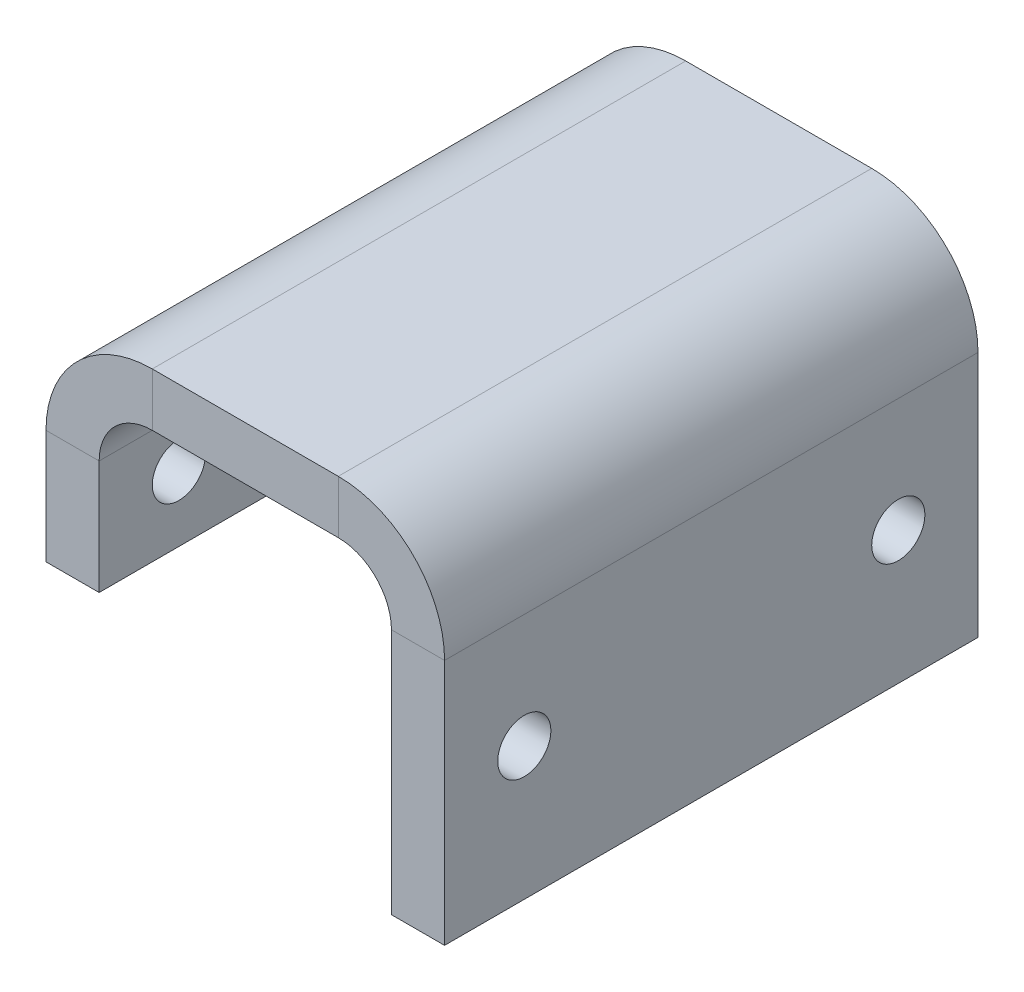
ISO-10303-21;
HEADER;
FILE_DESCRIPTION(('STEP AP214'),'2;1');
FILE_NAME('part.step','',(''),(''),'','','');
FILE_SCHEMA(('AUTOMOTIVE_DESIGN { 1 0 10303 214 1 1 1 1 }'));
ENDSEC;
DATA;
#1=APPLICATION_CONTEXT('core data for automotive mechanical design processes');
#2=APPLICATION_PROTOCOL_DEFINITION('international standard','automotive_design',2000,#1);
#3=PRODUCT_CONTEXT('',#1,'mechanical');
#4=PRODUCT('Part','Part','',(#3));
#5=PRODUCT_RELATED_PRODUCT_CATEGORY('part','',(#4));
#6=PRODUCT_DEFINITION_FORMATION('','',#4);
#7=PRODUCT_DEFINITION_CONTEXT('part definition',#1,'design');
#8=PRODUCT_DEFINITION('design','',#6,#7);
#9=PRODUCT_DEFINITION_SHAPE('','',#8);
#10=(LENGTH_UNIT() NAMED_UNIT(*) SI_UNIT(.MILLI.,.METRE.));
#11=(NAMED_UNIT(*) PLANE_ANGLE_UNIT() SI_UNIT($,.RADIAN.));
#12=(NAMED_UNIT(*) SI_UNIT($,.STERADIAN.) SOLID_ANGLE_UNIT());
#13=UNCERTAINTY_MEASURE_WITH_UNIT(LENGTH_MEASURE(1.E-05),#10,'distance_accuracy_value','');
#14=(GEOMETRIC_REPRESENTATION_CONTEXT(3) GLOBAL_UNCERTAINTY_ASSIGNED_CONTEXT((#13)) GLOBAL_UNIT_ASSIGNED_CONTEXT((#10,
#11,#12)) REPRESENTATION_CONTEXT('',''));
#15=CARTESIAN_POINT('',(0.,0.,0.));
#16=DIRECTION('',(0.,0.,1.));
#17=DIRECTION('',(1.,0.,0.));
#18=AXIS2_PLACEMENT_3D('',#15,#16,#17);
#19=CARTESIAN_POINT('',(-30.,-4.,20.075));
#20=DIRECTION('',(0.,0.,1.));
#21=DIRECTION('',(1.,0.,0.));
#22=AXIS2_PLACEMENT_3D('',#19,#20,#21);
#23=PLANE('',#22);
#24=DIRECTION('',(1.,0.,0.));
#25=VECTOR('',#24,1.);
#26=CARTESIAN_POINT('',(-30.,-4.,20.075));
#27=LINE('',#26,#25);
#28=CARTESIAN_POINT('',(-12.,-4.,20.075));
#29=VERTEX_POINT('',#28);
#30=CARTESIAN_POINT('',(2.00000000000003,-4.,20.075));
#31=VERTEX_POINT('',#30);
#32=EDGE_CURVE('E219',#29,#31,#27,.T.);
#33=ORIENTED_EDGE('',*,*,#32,.T.);
#34=DIRECTION('',(0.,1.,0.));
#35=VECTOR('',#34,1.);
#36=CARTESIAN_POINT('',(2.00000000000003,-4.,20.075));
#37=LINE('',#36,#35);
#38=CARTESIAN_POINT('',(2.00000000000003,0.,20.075));
#39=VERTEX_POINT('',#38);
#40=EDGE_CURVE('E12',#31,#39,#37,.T.);
#41=ORIENTED_EDGE('',*,*,#40,.T.);
#42=DIRECTION('',(1.,0.,0.));
#43=VECTOR('',#42,1.);
#44=CARTESIAN_POINT('',(-30.,0.,20.075));
#45=LINE('',#44,#43);
#46=CARTESIAN_POINT('',(-12.,0.,20.075));
#47=VERTEX_POINT('',#46);
#48=EDGE_CURVE('E203',#47,#39,#45,.T.);
#49=ORIENTED_EDGE('',*,*,#48,.F.);
#50=DIRECTION('',(0.,1.,0.));
#51=VECTOR('',#50,1.);
#52=CARTESIAN_POINT('',(-12.,-4.,20.075));
#53=LINE('',#52,#51);
#54=EDGE_CURVE('E208',#29,#47,#53,.T.);
#55=ORIENTED_EDGE('',*,*,#54,.F.);
#56=EDGE_LOOP('',(#33,#41,#49,#55));
#57=FACE_BOUND('',#56,.T.);
#58=ADVANCED_FACE('F45',(#57),#23,.T.);
#59=CARTESIAN_POINT('',(-30.,-4.,-20.075));
#60=DIRECTION('',(0.,0.,-1.));
#61=DIRECTION('',(-1.,0.,0.));
#62=AXIS2_PLACEMENT_3D('',#59,#60,#61);
#63=PLANE('',#62);
#64=DIRECTION('',(-1.,0.,0.));
#65=VECTOR('',#64,1.);
#66=CARTESIAN_POINT('',(-30.,0.,-20.075));
#67=LINE('',#66,#65);
#68=CARTESIAN_POINT('',(2.00000000000002,0.,-20.075));
#69=VERTEX_POINT('',#68);
#70=CARTESIAN_POINT('',(-12.,0.,-20.075));
#71=VERTEX_POINT('',#70);
#72=EDGE_CURVE('E204',#69,#71,#67,.T.);
#73=ORIENTED_EDGE('',*,*,#72,.F.);
#74=DIRECTION('',(0.,-1.,0.));
#75=VECTOR('',#74,1.);
#76=CARTESIAN_POINT('',(2.00000000000002,-4.,-20.075));
#77=LINE('',#76,#75);
#78=CARTESIAN_POINT('',(2.00000000000002,-4.,-20.075));
#79=VERTEX_POINT('',#78);
#80=EDGE_CURVE('E260',#69,#79,#77,.T.);
#81=ORIENTED_EDGE('',*,*,#80,.T.);
#82=DIRECTION('',(-1.,0.,0.));
#83=VECTOR('',#82,1.);
#84=CARTESIAN_POINT('',(-30.,-4.,-20.075));
#85=LINE('',#84,#83);
#86=CARTESIAN_POINT('',(-12.,-4.,-20.075));
#87=VERTEX_POINT('',#86);
#88=EDGE_CURVE('E48',#79,#87,#85,.T.);
#89=ORIENTED_EDGE('',*,*,#88,.T.);
#90=DIRECTION('',(0.,-1.,0.));
#91=VECTOR('',#90,1.);
#92=CARTESIAN_POINT('',(-12.,-4.,-20.075));
#93=LINE('',#92,#91);
#94=EDGE_CURVE('E205',#71,#87,#93,.T.);
#95=ORIENTED_EDGE('',*,*,#94,.F.);
#96=EDGE_LOOP('',(#73,#81,#89,#95));
#97=FACE_BOUND('',#96,.T.);
#98=ADVANCED_FACE('F273',(#97),#63,.T.);
#99=CARTESIAN_POINT('',(0.,-4.,0.));
#100=DIRECTION('',(0.,-1.,0.));
#101=DIRECTION('',(0.,0.,-1.));
#102=AXIS2_PLACEMENT_3D('',#99,#100,#101);
#103=PLANE('',#102);
#104=ORIENTED_EDGE('',*,*,#88,.F.);
#105=DIRECTION('',(0.,0.,1.));
#106=VECTOR('',#105,1.);
#107=CARTESIAN_POINT('',(2.00000000000003,-4.,0.));
#108=LINE('',#107,#106);
#109=EDGE_CURVE('E251',#79,#31,#108,.T.);
#110=ORIENTED_EDGE('',*,*,#109,.T.);
#111=ORIENTED_EDGE('',*,*,#32,.F.);
#112=DIRECTION('',(0.,0.,1.));
#113=VECTOR('',#112,1.);
#114=CARTESIAN_POINT('',(-12.,-4.,0.));
#115=LINE('',#114,#113);
#116=EDGE_CURVE('E195',#87,#29,#115,.T.);
#117=ORIENTED_EDGE('',*,*,#116,.F.);
#118=EDGE_LOOP('',(#104,#110,#111,#117));
#119=FACE_BOUND('',#118,.T.);
#120=ADVANCED_FACE('F276',(#119),#103,.T.);
#121=CARTESIAN_POINT('',(-16.,-16.5752220392306,20.075));
#122=DIRECTION('',(0.,0.,1.));
#123=DIRECTION('',(0.,1.,0.));
#124=AXIS2_PLACEMENT_3D('',#121,#122,#123);
#125=PLANE('',#124);
#126=DIRECTION('',(0.,1.,0.));
#127=VECTOR('',#126,1.);
#128=CARTESIAN_POINT('',(-16.,-16.5752220392306,20.075));
#129=LINE('',#128,#127);
#130=CARTESIAN_POINT('',(-16.,-16.5752220392306,20.075));
#131=VERTEX_POINT('',#130);
#132=CARTESIAN_POINT('',(-16.,-8.00000000000001,20.075));
#133=VERTEX_POINT('',#132);
#134=EDGE_CURVE('E229',#131,#133,#129,.T.);
#135=ORIENTED_EDGE('',*,*,#134,.T.);
#136=DIRECTION('',(-1.,0.,0.));
#137=VECTOR('',#136,1.);
#138=CARTESIAN_POINT('',(-16.,-8.00000000000001,20.075));
#139=LINE('',#138,#137);
#140=CARTESIAN_POINT('',(-20.,-8.00000000000004,20.075));
#141=VERTEX_POINT('',#140);
#142=EDGE_CURVE('E248',#133,#141,#139,.T.);
#143=ORIENTED_EDGE('',*,*,#142,.T.);
#144=DIRECTION('',(0.,1.,0.));
#145=VECTOR('',#144,1.);
#146=CARTESIAN_POINT('',(-20.,-16.5752220392306,20.075));
#147=LINE('',#146,#145);
#148=CARTESIAN_POINT('',(-20.,-16.5752220392306,20.075));
#149=VERTEX_POINT('',#148);
#150=EDGE_CURVE('E234',#149,#141,#147,.T.);
#151=ORIENTED_EDGE('',*,*,#150,.F.);
#152=DIRECTION('',(-1.,0.,0.));
#153=VECTOR('',#152,1.);
#154=CARTESIAN_POINT('',(-16.,-16.5752220392306,20.075));
#155=LINE('',#154,#153);
#156=EDGE_CURVE('E235',#131,#149,#155,.T.);
#157=ORIENTED_EDGE('',*,*,#156,.F.);
#158=EDGE_LOOP('',(#135,#143,#151,#157));
#159=FACE_BOUND('',#158,.T.);
#160=ADVANCED_FACE('F289',(#159),#125,.T.);
#161=CARTESIAN_POINT('',(-16.,-16.5752220392306,-20.075));
#162=DIRECTION('',(0.,0.,-1.));
#163=DIRECTION('',(0.,-1.,0.));
#164=AXIS2_PLACEMENT_3D('',#161,#162,#163);
#165=PLANE('',#164);
#166=DIRECTION('',(0.,-1.,0.));
#167=VECTOR('',#166,1.);
#168=CARTESIAN_POINT('',(-20.,-16.5752220392306,-20.075));
#169=LINE('',#168,#167);
#170=CARTESIAN_POINT('',(-20.,-8.00000000000004,-20.075));
#171=VERTEX_POINT('',#170);
#172=CARTESIAN_POINT('',(-20.,-16.5752220392306,-20.075));
#173=VERTEX_POINT('',#172);
#174=EDGE_CURVE('E223',#171,#173,#169,.T.);
#175=ORIENTED_EDGE('',*,*,#174,.F.);
#176=DIRECTION('',(1.,0.,0.));
#177=VECTOR('',#176,1.);
#178=CARTESIAN_POINT('',(-16.,-8.00000000000001,-20.075));
#179=LINE('',#178,#177);
#180=CARTESIAN_POINT('',(-16.,-8.00000000000002,-20.075));
#181=VERTEX_POINT('',#180);
#182=EDGE_CURVE('E243',#171,#181,#179,.T.);
#183=ORIENTED_EDGE('',*,*,#182,.T.);
#184=DIRECTION('',(0.,-1.,0.));
#185=VECTOR('',#184,1.);
#186=CARTESIAN_POINT('',(-16.,-16.5752220392306,-20.075));
#187=LINE('',#186,#185);
#188=CARTESIAN_POINT('',(-16.,-16.5752220392306,-20.075));
#189=VERTEX_POINT('',#188);
#190=EDGE_CURVE('E230',#181,#189,#187,.T.);
#191=ORIENTED_EDGE('',*,*,#190,.T.);
#192=DIRECTION('',(-1.,0.,0.));
#193=VECTOR('',#192,1.);
#194=CARTESIAN_POINT('',(-16.,-16.5752220392306,-20.075));
#195=LINE('',#194,#193);
#196=EDGE_CURVE('E238',#189,#173,#195,.T.);
#197=ORIENTED_EDGE('',*,*,#196,.T.);
#198=EDGE_LOOP('',(#175,#183,#191,#197));
#199=FACE_BOUND('',#198,.T.);
#200=ADVANCED_FACE('F297',(#199),#165,.T.);
#201=CARTESIAN_POINT('',(-16.0000000000001,13.4247779607694,0.));
#202=DIRECTION('',(1.,0.,0.));
#203=DIRECTION('',(0.,0.,-1.));
#204=AXIS2_PLACEMENT_3D('',#201,#202,#203);
#205=PLANE('',#204);
#206=CARTESIAN_POINT('',(-16.,-11.5752220392306,-14.075));
#207=DIRECTION('',(-1.,0.,0.));
#208=DIRECTION('',(0.,0.,1.));
#209=AXIS2_PLACEMENT_3D('',#206,#207,#208);
#210=CIRCLE('',#209,2.);
#211=CARTESIAN_POINT('',(-16.,-11.5752220392306,-12.075));
#212=VERTEX_POINT('',#211);
#213=EDGE_CURVE('E220',#212,#212,#210,.T.);
#214=ORIENTED_EDGE('',*,*,#213,.T.);
#215=EDGE_LOOP('',(#214));
#216=FACE_BOUND('',#215,.T.);
#217=CARTESIAN_POINT('',(-16.,-11.5752220392306,14.075));
#218=DIRECTION('',(-1.,0.,0.));
#219=DIRECTION('',(0.,0.,-1.));
#220=AXIS2_PLACEMENT_3D('',#217,#218,#219);
#221=CIRCLE('',#220,2.);
#222=CARTESIAN_POINT('',(-16.,-11.5752220392306,12.075));
#223=VERTEX_POINT('',#222);
#224=EDGE_CURVE('E212',#223,#223,#221,.T.);
#225=ORIENTED_EDGE('',*,*,#224,.T.);
#226=EDGE_LOOP('',(#225));
#227=FACE_BOUND('',#226,.T.);
#228=ORIENTED_EDGE('',*,*,#190,.F.);
#229=DIRECTION('',(0.,0.,1.));
#230=VECTOR('',#229,1.);
#231=CARTESIAN_POINT('',(-16.,-8.00000000000001,0.));
#232=LINE('',#231,#230);
#233=EDGE_CURVE('E237',#181,#133,#232,.T.);
#234=ORIENTED_EDGE('',*,*,#233,.T.);
#235=ORIENTED_EDGE('',*,*,#134,.F.);
#236=DIRECTION('',(0.,0.,1.));
#237=VECTOR('',#236,1.);
#238=CARTESIAN_POINT('',(-16.,-16.5752220392306,20.075));
#239=LINE('',#238,#237);
#240=EDGE_CURVE('E226',#189,#131,#239,.T.);
#241=ORIENTED_EDGE('',*,*,#240,.F.);
#242=EDGE_LOOP('',(#228,#234,#235,#241));
#243=FACE_BOUND('',#242,.T.);
#244=ADVANCED_FACE('F286',(#216,#227,#243),#205,.T.);
#245=CARTESIAN_POINT('',(-16.,-16.5752220392306,20.075));
#246=DIRECTION('',(0.,-1.,0.));
#247=DIRECTION('',(0.,0.,1.));
#248=AXIS2_PLACEMENT_3D('',#245,#246,#247);
#249=PLANE('',#248);
#250=DIRECTION('',(0.,0.,1.));
#251=VECTOR('',#250,1.);
#252=CARTESIAN_POINT('',(-20.,-16.5752220392306,20.075));
#253=LINE('',#252,#251);
#254=EDGE_CURVE('E231',#173,#149,#253,.T.);
#255=ORIENTED_EDGE('',*,*,#254,.F.);
#256=ORIENTED_EDGE('',*,*,#196,.F.);
#257=ORIENTED_EDGE('',*,*,#240,.T.);
#258=ORIENTED_EDGE('',*,*,#156,.T.);
#259=EDGE_LOOP('',(#255,#256,#257,#258));
#260=FACE_BOUND('',#259,.T.);
#261=ADVANCED_FACE('F294',(#260),#249,.T.);
#262=CARTESIAN_POINT('',(-20.0000000000001,13.4247779607694,0.));
#263=DIRECTION('',(1.,0.,0.));
#264=DIRECTION('',(0.,0.,-1.));
#265=AXIS2_PLACEMENT_3D('',#262,#263,#264);
#266=PLANE('',#265);
#267=DIRECTION('',(0.,0.,1.));
#268=VECTOR('',#267,1.);
#269=CARTESIAN_POINT('',(-20.,-8.00000000000003,0.));
#270=LINE('',#269,#268);
#271=EDGE_CURVE('E246',#171,#141,#270,.T.);
#272=ORIENTED_EDGE('',*,*,#271,.F.);
#273=ORIENTED_EDGE('',*,*,#174,.T.);
#274=ORIENTED_EDGE('',*,*,#254,.T.);
#275=ORIENTED_EDGE('',*,*,#150,.T.);
#276=EDGE_LOOP('',(#272,#273,#274,#275));
#277=FACE_BOUND('',#276,.T.);
#278=CARTESIAN_POINT('',(-20.,-11.5752220392306,14.075));
#279=DIRECTION('',(-1.,0.,0.));
#280=DIRECTION('',(0.,0.,-1.));
#281=AXIS2_PLACEMENT_3D('',#278,#279,#280);
#282=CIRCLE('',#281,2.);
#283=CARTESIAN_POINT('',(-20.,-11.5752220392306,12.075));
#284=VERTEX_POINT('',#283);
#285=EDGE_CURVE('E216',#284,#284,#282,.T.);
#286=ORIENTED_EDGE('',*,*,#285,.F.);
#287=EDGE_LOOP('',(#286));
#288=FACE_BOUND('',#287,.T.);
#289=CARTESIAN_POINT('',(-20.,-11.5752220392306,-14.075));
#290=DIRECTION('',(-1.,0.,0.));
#291=DIRECTION('',(0.,0.,1.));
#292=AXIS2_PLACEMENT_3D('',#289,#290,#291);
#293=CIRCLE('',#292,2.);
#294=CARTESIAN_POINT('',(-20.,-11.5752220392306,-12.075));
#295=VERTEX_POINT('',#294);
#296=EDGE_CURVE('E215',#295,#295,#293,.T.);
#297=ORIENTED_EDGE('',*,*,#296,.F.);
#298=EDGE_LOOP('',(#297));
#299=FACE_BOUND('',#298,.T.);
#300=ADVANCED_FACE('F378',(#277,#288,#299),#266,.F.);
#301=CARTESIAN_POINT('',(-16.,-11.5752220392306,-14.075));
#302=DIRECTION('',(-1.,0.,0.));
#303=DIRECTION('',(0.,0.,1.));
#304=AXIS2_PLACEMENT_3D('',#301,#302,#303);
#305=CYLINDRICAL_SURFACE('',#304,2.);
#306=ORIENTED_EDGE('',*,*,#213,.F.);
#307=EDGE_LOOP('',(#306));
#308=FACE_BOUND('',#307,.T.);
#309=ORIENTED_EDGE('',*,*,#296,.T.);
#310=EDGE_LOOP('',(#309));
#311=FACE_BOUND('',#310,.T.);
#312=ADVANCED_FACE('F372',(#308,#311),#305,.F.);
#313=CARTESIAN_POINT('',(-16.,-11.5752220392306,14.075));
#314=DIRECTION('',(-1.,0.,0.));
#315=DIRECTION('',(0.,0.,1.));
#316=AXIS2_PLACEMENT_3D('',#313,#314,#315);
#317=CYLINDRICAL_SURFACE('',#316,2.);
#318=ORIENTED_EDGE('',*,*,#224,.F.);
#319=EDGE_LOOP('',(#318));
#320=FACE_BOUND('',#319,.T.);
#321=ORIENTED_EDGE('',*,*,#285,.T.);
#322=EDGE_LOOP('',(#321));
#323=FACE_BOUND('',#322,.T.);
#324=ADVANCED_FACE('F366',(#320,#323),#317,.F.);
#325=CARTESIAN_POINT('',(0.,0.,0.));
#326=DIRECTION('',(0.,-1.,0.));
#327=DIRECTION('',(0.,0.,-1.));
#328=AXIS2_PLACEMENT_3D('',#325,#326,#327);
#329=PLANE('',#328);
#330=DIRECTION('',(0.,0.,1.));
#331=VECTOR('',#330,1.);
#332=CARTESIAN_POINT('',(2.00000000000003,0.,0.));
#333=LINE('',#332,#331);
#334=EDGE_CURVE('E53',#69,#39,#333,.T.);
#335=ORIENTED_EDGE('',*,*,#334,.F.);
#336=ORIENTED_EDGE('',*,*,#72,.T.);
#337=DIRECTION('',(0.,0.,1.));
#338=VECTOR('',#337,1.);
#339=CARTESIAN_POINT('',(-12.,0.,0.));
#340=LINE('',#339,#338);
#341=EDGE_CURVE('E200',#71,#47,#340,.T.);
#342=ORIENTED_EDGE('',*,*,#341,.T.);
#343=ORIENTED_EDGE('',*,*,#48,.T.);
#344=EDGE_LOOP('',(#335,#336,#342,#343));
#345=FACE_BOUND('',#344,.T.);
#346=ADVANCED_FACE('F302',(#345),#329,.F.);
#347=CARTESIAN_POINT('',(-12.,-8.,-20.075));
#348=DIRECTION('',(0.,0.,1.));
#349=DIRECTION('',(1.,0.,0.));
#350=AXIS2_PLACEMENT_3D('',#347,#348,#349);
#351=PLANE('',#350);
#352=ORIENTED_EDGE('',*,*,#182,.F.);
#353=CARTESIAN_POINT('',(-12.,-8.,-20.075));
#354=DIRECTION('',(0.,0.,-1.));
#355=DIRECTION('',(-1.,0.,0.));
#356=AXIS2_PLACEMENT_3D('',#353,#354,#355);
#357=CIRCLE('',#356,8.);
#358=EDGE_CURVE('E186',#171,#71,#357,.T.);
#359=ORIENTED_EDGE('',*,*,#358,.T.);
#360=ORIENTED_EDGE('',*,*,#94,.T.);
#361=CARTESIAN_POINT('',(-12.,-8.,-20.075));
#362=DIRECTION('',(0.,0.,-1.));
#363=DIRECTION('',(1.,0.,0.));
#364=AXIS2_PLACEMENT_3D('',#361,#362,#363);
#365=CIRCLE('',#364,4.);
#366=EDGE_CURVE('E190',#181,#87,#365,.T.);
#367=ORIENTED_EDGE('',*,*,#366,.F.);
#368=EDGE_LOOP('',(#352,#359,#360,#367));
#369=FACE_BOUND('',#368,.T.);
#370=ADVANCED_FACE('F280',(#369),#351,.F.);
#371=CARTESIAN_POINT('',(-12.,-8.,20.075));
#372=DIRECTION('',(0.,0.,-1.));
#373=DIRECTION('',(-1.,0.,0.));
#374=AXIS2_PLACEMENT_3D('',#371,#372,#373);
#375=PLANE('',#374);
#376=CARTESIAN_POINT('',(-12.,-8.,20.075));
#377=DIRECTION('',(0.,0.,-1.));
#378=DIRECTION('',(-1.,0.,0.));
#379=AXIS2_PLACEMENT_3D('',#376,#377,#378);
#380=CIRCLE('',#379,8.);
#381=EDGE_CURVE('E193',#47,#141,#380,.F.);
#382=ORIENTED_EDGE('',*,*,#381,.T.);
#383=ORIENTED_EDGE('',*,*,#142,.F.);
#384=CARTESIAN_POINT('',(-12.,-8.,20.075));
#385=DIRECTION('',(0.,0.,1.));
#386=DIRECTION('',(-1.,0.,0.));
#387=AXIS2_PLACEMENT_3D('',#384,#385,#386);
#388=CIRCLE('',#387,4.);
#389=EDGE_CURVE('E68',#29,#133,#388,.T.);
#390=ORIENTED_EDGE('',*,*,#389,.F.);
#391=ORIENTED_EDGE('',*,*,#54,.T.);
#392=EDGE_LOOP('',(#382,#383,#390,#391));
#393=FACE_BOUND('',#392,.T.);
#394=ADVANCED_FACE('F304',(#393),#375,.F.);
#395=CARTESIAN_POINT('',(-12.,-8.,41.4348758850537));
#396=DIRECTION('',(0.,0.,-1.));
#397=DIRECTION('',(-1.,0.,0.));
#398=AXIS2_PLACEMENT_3D('',#395,#396,#397);
#399=CYLINDRICAL_SURFACE('',#398,4.);
#400=ORIENTED_EDGE('',*,*,#116,.T.);
#401=ORIENTED_EDGE('',*,*,#389,.T.);
#402=ORIENTED_EDGE('',*,*,#233,.F.);
#403=ORIENTED_EDGE('',*,*,#366,.T.);
#404=EDGE_LOOP('',(#400,#401,#402,#403));
#405=FACE_BOUND('',#404,.T.);
#406=ADVANCED_FACE('F283',(#405),#399,.F.);
#407=CARTESIAN_POINT('',(-12.,-8.,41.4348758850537));
#408=DIRECTION('',(0.,0.,-1.));
#409=DIRECTION('',(-1.,0.,0.));
#410=AXIS2_PLACEMENT_3D('',#407,#408,#409);
#411=CYLINDRICAL_SURFACE('',#410,8.);
#412=ORIENTED_EDGE('',*,*,#341,.F.);
#413=ORIENTED_EDGE('',*,*,#358,.F.);
#414=ORIENTED_EDGE('',*,*,#271,.T.);
#415=ORIENTED_EDGE('',*,*,#381,.F.);
#416=EDGE_LOOP('',(#412,#413,#414,#415));
#417=FACE_BOUND('',#416,.T.);
#418=ADVANCED_FACE('F300',(#417),#411,.T.);
#419=CARTESIAN_POINT('',(2.00000000000002,-8.,-20.075));
#420=DIRECTION('',(0.,0.,1.));
#421=DIRECTION('',(1.,0.,0.));
#422=AXIS2_PLACEMENT_3D('',#419,#420,#421);
#423=PLANE('',#422);
#424=ORIENTED_EDGE('',*,*,#80,.F.);
#425=CARTESIAN_POINT('',(2.00000000000002,-8.,-20.075));
#426=DIRECTION('',(0.,0.,1.));
#427=DIRECTION('',(1.,0.,0.));
#428=AXIS2_PLACEMENT_3D('',#425,#426,#427);
#429=CIRCLE('',#428,8.);
#430=CARTESIAN_POINT('',(10.,-8.00000000000003,-20.075));
#431=VERTEX_POINT('',#430);
#432=EDGE_CURVE('E154',#69,#431,#429,.F.);
#433=ORIENTED_EDGE('',*,*,#432,.T.);
#434=DIRECTION('',(-1.,0.,0.));
#435=VECTOR('',#434,1.);
#436=CARTESIAN_POINT('',(6.00000000000002,-8.00000000000001,-20.075));
#437=LINE('',#436,#435);
#438=CARTESIAN_POINT('',(6.00000000000002,-8.00000000000001,-20.075));
#439=VERTEX_POINT('',#438);
#440=EDGE_CURVE('E173',#431,#439,#437,.T.);
#441=ORIENTED_EDGE('',*,*,#440,.T.);
#442=CARTESIAN_POINT('',(2.00000000000002,-8.,-20.075));
#443=DIRECTION('',(0.,0.,-1.));
#444=DIRECTION('',(1.,0.,0.));
#445=AXIS2_PLACEMENT_3D('',#442,#443,#444);
#446=CIRCLE('',#445,4.);
#447=EDGE_CURVE('E179',#79,#439,#446,.T.);
#448=ORIENTED_EDGE('',*,*,#447,.F.);
#449=EDGE_LOOP('',(#424,#433,#441,#448));
#450=FACE_BOUND('',#449,.T.);
#451=ADVANCED_FACE('F321',(#450),#423,.F.);
#452=CARTESIAN_POINT('',(2.00000000000003,-8.,20.075));
#453=DIRECTION('',(0.,0.,-1.));
#454=DIRECTION('',(-1.,0.,0.));
#455=AXIS2_PLACEMENT_3D('',#452,#453,#454);
#456=PLANE('',#455);
#457=DIRECTION('',(1.,0.,0.));
#458=VECTOR('',#457,1.);
#459=CARTESIAN_POINT('',(6.00000000000003,-8.00000000000001,20.075));
#460=LINE('',#459,#458);
#461=CARTESIAN_POINT('',(6.00000000000003,-8.00000000000001,20.075));
#462=VERTEX_POINT('',#461);
#463=CARTESIAN_POINT('',(10.,-8.00000000000003,20.075));
#464=VERTEX_POINT('',#463);
#465=EDGE_CURVE('E143',#462,#464,#460,.T.);
#466=ORIENTED_EDGE('',*,*,#465,.T.);
#467=CARTESIAN_POINT('',(2.00000000000003,-8.,20.075));
#468=DIRECTION('',(0.,0.,1.));
#469=DIRECTION('',(1.,0.,0.));
#470=AXIS2_PLACEMENT_3D('',#467,#468,#469);
#471=CIRCLE('',#470,8.);
#472=EDGE_CURVE('E183',#464,#39,#471,.T.);
#473=ORIENTED_EDGE('',*,*,#472,.T.);
#474=ORIENTED_EDGE('',*,*,#40,.F.);
#475=CARTESIAN_POINT('',(2.00000000000003,-8.,20.075));
#476=DIRECTION('',(0.,0.,1.));
#477=DIRECTION('',(-1.,0.,0.));
#478=AXIS2_PLACEMENT_3D('',#475,#476,#477);
#479=CIRCLE('',#478,4.);
#480=EDGE_CURVE('E182',#462,#31,#479,.T.);
#481=ORIENTED_EDGE('',*,*,#480,.F.);
#482=EDGE_LOOP('',(#466,#473,#474,#481));
#483=FACE_BOUND('',#482,.T.);
#484=ADVANCED_FACE('F308',(#483),#456,.F.);
#485=CARTESIAN_POINT('',(2.00000000000002,-8.,-41.4348758850537));
#486=DIRECTION('',(0.,0.,1.));
#487=DIRECTION('',(1.,0.,0.));
#488=AXIS2_PLACEMENT_3D('',#485,#486,#487);
#489=CYLINDRICAL_SURFACE('',#488,4.);
#490=ORIENTED_EDGE('',*,*,#480,.T.);
#491=ORIENTED_EDGE('',*,*,#109,.F.);
#492=ORIENTED_EDGE('',*,*,#447,.T.);
#493=DIRECTION('',(0.,0.,1.));
#494=VECTOR('',#493,1.);
#495=CARTESIAN_POINT('',(6.00000000000002,-8.00000000000002,0.));
#496=LINE('',#495,#494);
#497=EDGE_CURVE('E177',#439,#462,#496,.T.);
#498=ORIENTED_EDGE('',*,*,#497,.T.);
#499=EDGE_LOOP('',(#490,#491,#492,#498));
#500=FACE_BOUND('',#499,.T.);
#501=ADVANCED_FACE('F311',(#500),#489,.F.);
#502=CARTESIAN_POINT('',(2.00000000000002,-8.,-41.4348758850537));
#503=DIRECTION('',(0.,0.,1.));
#504=DIRECTION('',(1.,0.,0.));
#505=AXIS2_PLACEMENT_3D('',#502,#503,#504);
#506=CYLINDRICAL_SURFACE('',#505,8.);
#507=ORIENTED_EDGE('',*,*,#472,.F.);
#508=DIRECTION('',(0.,0.,1.));
#509=VECTOR('',#508,1.);
#510=CARTESIAN_POINT('',(10.,-8.00000000000003,0.));
#511=LINE('',#510,#509);
#512=EDGE_CURVE('E324',#431,#464,#511,.T.);
#513=ORIENTED_EDGE('',*,*,#512,.F.);
#514=ORIENTED_EDGE('',*,*,#432,.F.);
#515=ORIENTED_EDGE('',*,*,#334,.T.);
#516=EDGE_LOOP('',(#507,#513,#514,#515));
#517=FACE_BOUND('',#516,.T.);
#518=ADVANCED_FACE('F322',(#517),#506,.T.);
#519=CARTESIAN_POINT('',(5.99999999999999,-16.5752220392306,-14.075));
#520=DIRECTION('',(1.,0.,0.));
#521=DIRECTION('',(0.,0.,1.));
#522=AXIS2_PLACEMENT_3D('',#519,#520,#521);
#523=CYLINDRICAL_SURFACE('',#522,2.);
#524=CARTESIAN_POINT('',(5.99999999999999,-16.5752220392306,-14.075));
#525=DIRECTION('',(1.,0.,0.));
#526=DIRECTION('',(0.,0.,1.));
#527=AXIS2_PLACEMENT_3D('',#524,#525,#526);
#528=CIRCLE('',#527,2.);
#529=CARTESIAN_POINT('',(5.99999999999999,-16.5752220392306,-12.075));
#530=VERTEX_POINT('',#529);
#531=EDGE_CURVE('E318',#530,#530,#528,.T.);
#532=ORIENTED_EDGE('',*,*,#531,.F.);
#533=EDGE_LOOP('',(#532));
#534=FACE_BOUND('',#533,.T.);
#535=CARTESIAN_POINT('',(9.99999999999999,-16.5752220392306,-14.075));
#536=DIRECTION('',(1.,0.,0.));
#537=DIRECTION('',(0.,0.,1.));
#538=AXIS2_PLACEMENT_3D('',#535,#536,#537);
#539=CIRCLE('',#538,2.);
#540=CARTESIAN_POINT('',(9.99999999999999,-16.5752220392306,-12.075));
#541=VERTEX_POINT('',#540);
#542=EDGE_CURVE('E167',#541,#541,#539,.T.);
#543=ORIENTED_EDGE('',*,*,#542,.T.);
#544=EDGE_LOOP('',(#543));
#545=FACE_BOUND('',#544,.T.);
#546=ADVANCED_FACE('F340',(#534,#545),#523,.F.);
#547=CARTESIAN_POINT('',(5.99999999999999,-16.5752220392306,14.075));
#548=DIRECTION('',(1.,0.,0.));
#549=DIRECTION('',(0.,0.,1.));
#550=AXIS2_PLACEMENT_3D('',#547,#548,#549);
#551=CYLINDRICAL_SURFACE('',#550,2.);
#552=CARTESIAN_POINT('',(5.99999999999999,-16.5752220392306,14.075));
#553=DIRECTION('',(1.,0.,0.));
#554=DIRECTION('',(0.,0.,-1.));
#555=AXIS2_PLACEMENT_3D('',#552,#553,#554);
#556=CIRCLE('',#555,2.);
#557=CARTESIAN_POINT('',(5.99999999999999,-16.5752220392306,12.075));
#558=VERTEX_POINT('',#557);
#559=EDGE_CURVE('E164',#558,#558,#556,.T.);
#560=ORIENTED_EDGE('',*,*,#559,.F.);
#561=EDGE_LOOP('',(#560));
#562=FACE_BOUND('',#561,.T.);
#563=CARTESIAN_POINT('',(9.99999999999999,-16.5752220392306,14.075));
#564=DIRECTION('',(1.,0.,0.));
#565=DIRECTION('',(0.,0.,-1.));
#566=AXIS2_PLACEMENT_3D('',#563,#564,#565);
#567=CIRCLE('',#566,2.);
#568=CARTESIAN_POINT('',(9.99999999999999,-16.5752220392306,12.075));
#569=VERTEX_POINT('',#568);
#570=EDGE_CURVE('E162',#569,#569,#567,.T.);
#571=ORIENTED_EDGE('',*,*,#570,.T.);
#572=EDGE_LOOP('',(#571));
#573=FACE_BOUND('',#572,.T.);
#574=ADVANCED_FACE('F337',(#562,#573),#551,.F.);
#575=CARTESIAN_POINT('',(5.99999999999996,-26.5752220392306,20.075));
#576=DIRECTION('',(0.,-1.,0.));
#577=DIRECTION('',(0.,0.,-1.));
#578=AXIS2_PLACEMENT_3D('',#575,#576,#577);
#579=PLANE('',#578);
#580=DIRECTION('',(0.,0.,-1.));
#581=VECTOR('',#580,1.);
#582=CARTESIAN_POINT('',(9.99999999999996,-26.5752220392306,20.075));
#583=LINE('',#582,#581);
#584=CARTESIAN_POINT('',(9.99999999999996,-26.5752220392306,20.075));
#585=VERTEX_POINT('',#584);
#586=CARTESIAN_POINT('',(9.99999999999996,-26.5752220392306,-20.075));
#587=VERTEX_POINT('',#586);
#588=EDGE_CURVE('E147',#585,#587,#583,.T.);
#589=ORIENTED_EDGE('',*,*,#588,.F.);
#590=DIRECTION('',(1.,0.,0.));
#591=VECTOR('',#590,1.);
#592=CARTESIAN_POINT('',(5.99999999999996,-26.5752220392306,20.075));
#593=LINE('',#592,#591);
#594=CARTESIAN_POINT('',(5.99999999999996,-26.5752220392306,20.075));
#595=VERTEX_POINT('',#594);
#596=EDGE_CURVE('E140',#595,#585,#593,.T.);
#597=ORIENTED_EDGE('',*,*,#596,.F.);
#598=DIRECTION('',(0.,0.,-1.));
#599=VECTOR('',#598,1.);
#600=CARTESIAN_POINT('',(5.99999999999996,-26.5752220392306,20.075));
#601=LINE('',#600,#599);
#602=CARTESIAN_POINT('',(5.99999999999995,-26.5752220392306,-20.075));
#603=VERTEX_POINT('',#602);
#604=EDGE_CURVE('E152',#595,#603,#601,.T.);
#605=ORIENTED_EDGE('',*,*,#604,.T.);
#606=DIRECTION('',(1.,0.,0.));
#607=VECTOR('',#606,1.);
#608=CARTESIAN_POINT('',(5.99999999999995,-26.5752220392306,-20.075));
#609=LINE('',#608,#607);
#610=EDGE_CURVE('E161',#603,#587,#609,.T.);
#611=ORIENTED_EDGE('',*,*,#610,.T.);
#612=EDGE_LOOP('',(#589,#597,#605,#611));
#613=FACE_BOUND('',#612,.T.);
#614=ADVANCED_FACE('F151',(#613),#579,.T.);
#615=CARTESIAN_POINT('',(6.00000000000006,3.42477796076941,0.));
#616=DIRECTION('',(-1.,0.,0.));
#617=DIRECTION('',(0.,0.,-1.));
#618=AXIS2_PLACEMENT_3D('',#615,#616,#617);
#619=PLANE('',#618);
#620=ORIENTED_EDGE('',*,*,#497,.F.);
#621=DIRECTION('',(0.,1.,0.));
#622=VECTOR('',#621,1.);
#623=CARTESIAN_POINT('',(6.00000000000016,33.4247779607694,-20.075));
#624=LINE('',#623,#622);
#625=EDGE_CURVE('E160',#603,#439,#624,.T.);
#626=ORIENTED_EDGE('',*,*,#625,.F.);
#627=ORIENTED_EDGE('',*,*,#604,.F.);
#628=DIRECTION('',(0.,-1.,0.));
#629=VECTOR('',#628,1.);
#630=CARTESIAN_POINT('',(6.00000000000017,33.4247779607694,20.075));
#631=LINE('',#630,#629);
#632=EDGE_CURVE('E137',#462,#595,#631,.T.);
#633=ORIENTED_EDGE('',*,*,#632,.F.);
#634=EDGE_LOOP('',(#620,#626,#627,#633));
#635=FACE_BOUND('',#634,.T.);
#636=ORIENTED_EDGE('',*,*,#559,.T.);
#637=EDGE_LOOP('',(#636));
#638=FACE_BOUND('',#637,.T.);
#639=ORIENTED_EDGE('',*,*,#531,.T.);
#640=EDGE_LOOP('',(#639));
#641=FACE_BOUND('',#640,.T.);
#642=ADVANCED_FACE('F157',(#635,#638,#641),#619,.T.);
#643=CARTESIAN_POINT('',(6.00000000000016,33.4247779607694,-20.075));
#644=DIRECTION('',(0.,0.,-1.));
#645=DIRECTION('',(0.,1.,0.));
#646=AXIS2_PLACEMENT_3D('',#643,#644,#645);
#647=PLANE('',#646);
#648=ORIENTED_EDGE('',*,*,#440,.F.);
#649=DIRECTION('',(0.,1.,0.));
#650=VECTOR('',#649,1.);
#651=CARTESIAN_POINT('',(10.0000000000002,33.4247779607694,-20.075));
#652=LINE('',#651,#650);
#653=EDGE_CURVE('E317',#587,#431,#652,.T.);
#654=ORIENTED_EDGE('',*,*,#653,.F.);
#655=ORIENTED_EDGE('',*,*,#610,.F.);
#656=ORIENTED_EDGE('',*,*,#625,.T.);
#657=EDGE_LOOP('',(#648,#654,#655,#656));
#658=FACE_BOUND('',#657,.T.);
#659=ADVANCED_FACE('F314',(#658),#647,.T.);
#660=CARTESIAN_POINT('',(10.0000000000001,3.42477796076939,0.));
#661=DIRECTION('',(-1.,0.,0.));
#662=DIRECTION('',(0.,0.,-1.));
#663=AXIS2_PLACEMENT_3D('',#660,#661,#662);
#664=PLANE('',#663);
#665=ORIENTED_EDGE('',*,*,#542,.F.);
#666=EDGE_LOOP('',(#665));
#667=FACE_BOUND('',#666,.T.);
#668=ORIENTED_EDGE('',*,*,#570,.F.);
#669=EDGE_LOOP('',(#668));
#670=FACE_BOUND('',#669,.T.);
#671=ORIENTED_EDGE('',*,*,#653,.T.);
#672=ORIENTED_EDGE('',*,*,#512,.T.);
#673=DIRECTION('',(0.,-1.,0.));
#674=VECTOR('',#673,1.);
#675=CARTESIAN_POINT('',(10.0000000000002,33.4247779607694,20.075));
#676=LINE('',#675,#674);
#677=EDGE_CURVE('E326',#464,#585,#676,.T.);
#678=ORIENTED_EDGE('',*,*,#677,.T.);
#679=ORIENTED_EDGE('',*,*,#588,.T.);
#680=EDGE_LOOP('',(#671,#672,#678,#679));
#681=FACE_BOUND('',#680,.T.);
#682=ADVANCED_FACE('F344',(#667,#670,#681),#664,.F.);
#683=CARTESIAN_POINT('',(6.00000000000017,33.4247779607694,20.075));
#684=DIRECTION('',(0.,0.,1.));
#685=DIRECTION('',(0.,-1.,0.));
#686=AXIS2_PLACEMENT_3D('',#683,#684,#685);
#687=PLANE('',#686);
#688=ORIENTED_EDGE('',*,*,#465,.F.);
#689=ORIENTED_EDGE('',*,*,#632,.T.);
#690=ORIENTED_EDGE('',*,*,#596,.T.);
#691=ORIENTED_EDGE('',*,*,#677,.F.);
#692=EDGE_LOOP('',(#688,#689,#690,#691));
#693=FACE_BOUND('',#692,.T.);
#694=ADVANCED_FACE('F139',(#693),#687,.T.);
#695=CLOSED_SHELL('',(#58,#98,#120,#160,#200,#244,#261,#300,#312,#324,#346,#370,#394,#406,#418,
#451,#484,#501,#518,#546,#574,#614,#642,#659,#682,#694));
#696=MANIFOLD_SOLID_BREP('B2',#695);
#697=ADVANCED_BREP_SHAPE_REPRESENTATION('',(#18,#696),#14);
#698=SHAPE_DEFINITION_REPRESENTATION(#9,#697);
ENDSEC;
END-ISO-10303-21;
